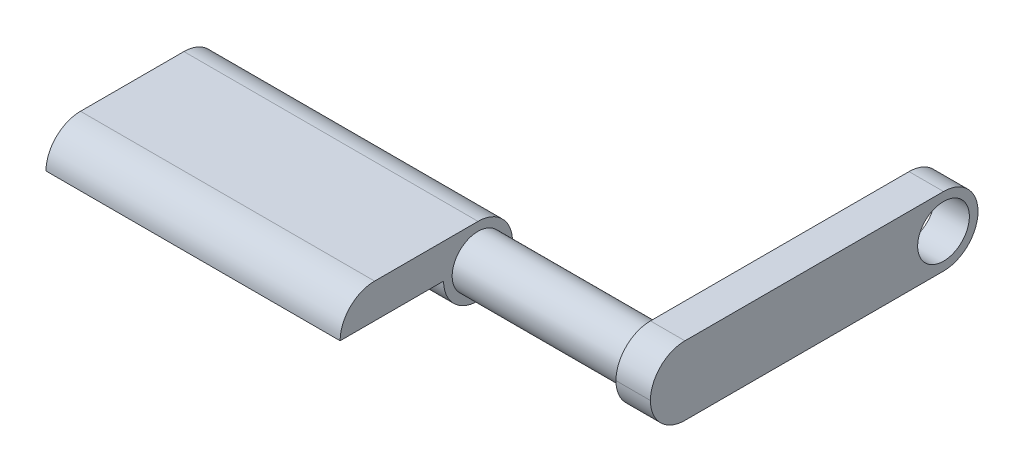
ISO-10303-21;
HEADER;
FILE_DESCRIPTION(('STEP AP214'),'2;1');
FILE_NAME('part.step','',(''),(''),'','','');
FILE_SCHEMA(('AUTOMOTIVE_DESIGN { 1 0 10303 214 1 1 1 1 }'));
ENDSEC;
DATA;
#1=APPLICATION_CONTEXT('core data for automotive mechanical design processes');
#2=APPLICATION_PROTOCOL_DEFINITION('international standard','automotive_design',2000,#1);
#3=PRODUCT_CONTEXT('',#1,'mechanical');
#4=PRODUCT('Part','Part','',(#3));
#5=PRODUCT_RELATED_PRODUCT_CATEGORY('part','',(#4));
#6=PRODUCT_DEFINITION_FORMATION('','',#4);
#7=PRODUCT_DEFINITION_CONTEXT('part definition',#1,'design');
#8=PRODUCT_DEFINITION('design','',#6,#7);
#9=PRODUCT_DEFINITION_SHAPE('','',#8);
#10=(LENGTH_UNIT() NAMED_UNIT(*) SI_UNIT(.MILLI.,.METRE.));
#11=(NAMED_UNIT(*) PLANE_ANGLE_UNIT() SI_UNIT($,.RADIAN.));
#12=(NAMED_UNIT(*) SI_UNIT($,.STERADIAN.) SOLID_ANGLE_UNIT());
#13=UNCERTAINTY_MEASURE_WITH_UNIT(LENGTH_MEASURE(1.E-05),#10,'distance_accuracy_value','');
#14=(GEOMETRIC_REPRESENTATION_CONTEXT(3) GLOBAL_UNCERTAINTY_ASSIGNED_CONTEXT((#13)) GLOBAL_UNIT_ASSIGNED_CONTEXT((#10,
#11,#12)) REPRESENTATION_CONTEXT('',''));
#15=CARTESIAN_POINT('',(0.,0.,0.));
#16=DIRECTION('',(0.,0.,1.));
#17=DIRECTION('',(1.,0.,0.));
#18=AXIS2_PLACEMENT_3D('',#15,#16,#17);
#19=CARTESIAN_POINT('',(29.06,0.,0.));
#20=DIRECTION('',(-1.,0.,0.));
#21=DIRECTION('',(0.,0.,1.));
#22=AXIS2_PLACEMENT_3D('',#19,#20,#21);
#23=CYLINDRICAL_SURFACE('',#22,1.5);
#24=CARTESIAN_POINT('',(17.06,0.,0.));
#25=DIRECTION('',(1.,0.,0.));
#26=DIRECTION('',(0.,0.,-1.));
#27=AXIS2_PLACEMENT_3D('',#24,#25,#26);
#28=CIRCLE('',#27,1.5);
#29=CARTESIAN_POINT('',(17.06,0.,-1.5));
#30=VERTEX_POINT('',#29);
#31=EDGE_CURVE('E148',#30,#30,#28,.T.);
#32=ORIENTED_EDGE('',*,*,#31,.T.);
#33=EDGE_LOOP('',(#32));
#34=FACE_BOUND('',#33,.T.);
#35=CARTESIAN_POINT('',(27.06,0.,0.));
#36=DIRECTION('',(1.,0.,0.));
#37=DIRECTION('',(0.,0.,-1.));
#38=AXIS2_PLACEMENT_3D('',#35,#36,#37);
#39=CIRCLE('',#38,1.5);
#40=CARTESIAN_POINT('',(27.06,0.,-1.5));
#41=VERTEX_POINT('',#40);
#42=EDGE_CURVE('E151',#41,#41,#39,.T.);
#43=ORIENTED_EDGE('',*,*,#42,.F.);
#44=EDGE_LOOP('',(#43));
#45=FACE_BOUND('',#44,.T.);
#46=ADVANCED_FACE('F33',(#34,#45),#23,.T.);
#47=CARTESIAN_POINT('',(17.06,0.,0.));
#48=DIRECTION('',(-1.,0.,0.));
#49=DIRECTION('',(0.,0.,1.));
#50=AXIS2_PLACEMENT_3D('',#47,#48,#49);
#51=CYLINDRICAL_SURFACE('',#50,2.);
#52=CARTESIAN_POINT('',(17.06,0.,0.));
#53=DIRECTION('',(1.,0.,0.));
#54=DIRECTION('',(0.,0.,-1.));
#55=AXIS2_PLACEMENT_3D('',#52,#53,#54);
#56=CIRCLE('',#55,2.);
#57=CARTESIAN_POINT('',(17.06,0.,2.));
#58=VERTEX_POINT('',#57);
#59=CARTESIAN_POINT('',(17.06,2.,0.));
#60=VERTEX_POINT('',#59);
#61=EDGE_CURVE('E152',#58,#60,#56,.T.);
#62=ORIENTED_EDGE('',*,*,#61,.F.);
#63=DIRECTION('',(-1.,0.,0.));
#64=VECTOR('',#63,1.);
#65=CARTESIAN_POINT('',(17.06,0.,2.));
#66=LINE('',#65,#64);
#67=CARTESIAN_POINT('',(0.,0.,2.));
#68=VERTEX_POINT('',#67);
#69=EDGE_CURVE('E121',#58,#68,#66,.T.);
#70=ORIENTED_EDGE('',*,*,#69,.T.);
#71=CARTESIAN_POINT('',(0.,0.,0.));
#72=DIRECTION('',(1.,0.,0.));
#73=DIRECTION('',(0.,0.,-1.));
#74=AXIS2_PLACEMENT_3D('',#71,#72,#73);
#75=CIRCLE('',#74,2.);
#76=CARTESIAN_POINT('',(0.,2.,0.));
#77=VERTEX_POINT('',#76);
#78=EDGE_CURVE('E143',#68,#77,#75,.T.);
#79=ORIENTED_EDGE('',*,*,#78,.T.);
#80=DIRECTION('',(-1.,0.,0.));
#81=VECTOR('',#80,1.);
#82=CARTESIAN_POINT('',(25.3062112512353,2.,0.));
#83=LINE('',#82,#81);
#84=EDGE_CURVE('E125',#60,#77,#83,.T.);
#85=ORIENTED_EDGE('',*,*,#84,.F.);
#86=EDGE_LOOP('',(#62,#70,#79,#85));
#87=FACE_BOUND('',#86,.T.);
#88=ADVANCED_FACE('F237',(#87),#51,.T.);
#89=CARTESIAN_POINT('',(17.06,0.,0.));
#90=DIRECTION('',(1.,0.,0.));
#91=DIRECTION('',(0.,0.,-1.));
#92=AXIS2_PLACEMENT_3D('',#89,#90,#91);
#93=PLANE('',#92);
#94=ORIENTED_EDGE('',*,*,#31,.F.);
#95=EDGE_LOOP('',(#94));
#96=FACE_BOUND('',#95,.T.);
#97=DIRECTION('',(0.,0.,-1.));
#98=VECTOR('',#97,1.);
#99=CARTESIAN_POINT('',(17.06,2.,0.));
#100=LINE('',#99,#98);
#101=CARTESIAN_POINT('',(17.06,2.,6.));
#102=VERTEX_POINT('',#101);
#103=EDGE_CURVE('E113',#102,#60,#100,.T.);
#104=ORIENTED_EDGE('',*,*,#103,.F.);
#105=CARTESIAN_POINT('',(17.06,0.,6.));
#106=DIRECTION('',(1.,0.,0.));
#107=DIRECTION('',(0.,0.,-1.));
#108=AXIS2_PLACEMENT_3D('',#105,#106,#107);
#109=CIRCLE('',#108,2.);
#110=CARTESIAN_POINT('',(17.06,0.,8.));
#111=VERTEX_POINT('',#110);
#112=EDGE_CURVE('E11',#102,#111,#109,.T.);
#113=ORIENTED_EDGE('',*,*,#112,.T.);
#114=DIRECTION('',(0.,0.,1.));
#115=VECTOR('',#114,1.);
#116=CARTESIAN_POINT('',(17.06,0.,0.));
#117=LINE('',#116,#115);
#118=EDGE_CURVE('E111',#58,#111,#117,.T.);
#119=ORIENTED_EDGE('',*,*,#118,.F.);
#120=ORIENTED_EDGE('',*,*,#61,.T.);
#121=EDGE_LOOP('',(#104,#113,#119,#120));
#122=FACE_BOUND('',#121,.T.);
#123=ADVANCED_FACE('F109',(#96,#122),#93,.T.);
#124=CARTESIAN_POINT('',(0.,0.,0.));
#125=DIRECTION('',(1.,0.,0.));
#126=DIRECTION('',(0.,0.,-1.));
#127=AXIS2_PLACEMENT_3D('',#124,#125,#126);
#128=PLANE('',#127);
#129=DIRECTION('',(0.,0.,1.));
#130=VECTOR('',#129,1.);
#131=CARTESIAN_POINT('',(0.,0.,0.));
#132=LINE('',#131,#130);
#133=CARTESIAN_POINT('',(0.,0.,8.));
#134=VERTEX_POINT('',#133);
#135=EDGE_CURVE('E385',#68,#134,#132,.T.);
#136=ORIENTED_EDGE('',*,*,#135,.T.);
#137=CARTESIAN_POINT('',(0.,0.,6.));
#138=DIRECTION('',(1.,0.,0.));
#139=DIRECTION('',(0.,0.,-1.));
#140=AXIS2_PLACEMENT_3D('',#137,#138,#139);
#141=CIRCLE('',#140,2.);
#142=CARTESIAN_POINT('',(0.,2.,6.));
#143=VERTEX_POINT('',#142);
#144=EDGE_CURVE('E55',#134,#143,#141,.F.);
#145=ORIENTED_EDGE('',*,*,#144,.T.);
#146=DIRECTION('',(0.,0.,-1.));
#147=VECTOR('',#146,1.);
#148=CARTESIAN_POINT('',(0.,2.,0.));
#149=LINE('',#148,#147);
#150=EDGE_CURVE('E122',#143,#77,#149,.T.);
#151=ORIENTED_EDGE('',*,*,#150,.T.);
#152=ORIENTED_EDGE('',*,*,#78,.F.);
#153=EDGE_LOOP('',(#136,#145,#151,#152));
#154=FACE_BOUND('',#153,.T.);
#155=ADVANCED_FACE('F249',(#154),#128,.F.);
#156=CARTESIAN_POINT('',(27.06,2.,2.));
#157=DIRECTION('',(0.,1.,0.));
#158=DIRECTION('',(0.,0.,1.));
#159=AXIS2_PLACEMENT_3D('',#156,#157,#158);
#160=PLANE('',#159);
#161=DIRECTION('',(0.,0.,1.));
#162=VECTOR('',#161,1.);
#163=CARTESIAN_POINT('',(29.06,2.,2.));
#164=LINE('',#163,#162);
#165=CARTESIAN_POINT('',(29.06,2.,-15.));
#166=VERTEX_POINT('',#165);
#167=CARTESIAN_POINT('',(29.06,2.,0.));
#168=VERTEX_POINT('',#167);
#169=EDGE_CURVE('E141',#166,#168,#164,.T.);
#170=ORIENTED_EDGE('',*,*,#169,.F.);
#171=DIRECTION('',(-1.,0.,0.));
#172=VECTOR('',#171,1.);
#173=CARTESIAN_POINT('',(27.06,2.,-15.));
#174=LINE('',#173,#172);
#175=CARTESIAN_POINT('',(27.06,2.,-15.));
#176=VERTEX_POINT('',#175);
#177=EDGE_CURVE('E187',#166,#176,#174,.T.);
#178=ORIENTED_EDGE('',*,*,#177,.T.);
#179=DIRECTION('',(0.,0.,1.));
#180=VECTOR('',#179,1.);
#181=CARTESIAN_POINT('',(27.06,2.,2.));
#182=LINE('',#181,#180);
#183=CARTESIAN_POINT('',(27.06,2.,0.));
#184=VERTEX_POINT('',#183);
#185=EDGE_CURVE('E140',#176,#184,#182,.T.);
#186=ORIENTED_EDGE('',*,*,#185,.T.);
#187=DIRECTION('',(1.,0.,0.));
#188=VECTOR('',#187,1.);
#189=CARTESIAN_POINT('',(27.06,2.,0.));
#190=LINE('',#189,#188);
#191=EDGE_CURVE('E158',#184,#168,#190,.T.);
#192=ORIENTED_EDGE('',*,*,#191,.T.);
#193=EDGE_LOOP('',(#170,#178,#186,#192));
#194=FACE_BOUND('',#193,.T.);
#195=ADVANCED_FACE('F206',(#194),#160,.T.);
#196=CARTESIAN_POINT('',(27.06,-2.,2.));
#197=DIRECTION('',(0.,-1.,0.));
#198=DIRECTION('',(0.,0.,-1.));
#199=AXIS2_PLACEMENT_3D('',#196,#197,#198);
#200=PLANE('',#199);
#201=DIRECTION('',(0.,0.,-1.));
#202=VECTOR('',#201,1.);
#203=CARTESIAN_POINT('',(27.06,-2.,2.));
#204=LINE('',#203,#202);
#205=CARTESIAN_POINT('',(27.06,-2.,0.));
#206=VERTEX_POINT('',#205);
#207=CARTESIAN_POINT('',(27.06,-2.,-15.));
#208=VERTEX_POINT('',#207);
#209=EDGE_CURVE('E137',#206,#208,#204,.T.);
#210=ORIENTED_EDGE('',*,*,#209,.T.);
#211=DIRECTION('',(1.,0.,0.));
#212=VECTOR('',#211,1.);
#213=CARTESIAN_POINT('',(27.06,-2.,-15.));
#214=LINE('',#213,#212);
#215=CARTESIAN_POINT('',(29.06,-2.,-15.));
#216=VERTEX_POINT('',#215);
#217=EDGE_CURVE('E176',#208,#216,#214,.T.);
#218=ORIENTED_EDGE('',*,*,#217,.T.);
#219=DIRECTION('',(0.,0.,-1.));
#220=VECTOR('',#219,1.);
#221=CARTESIAN_POINT('',(29.06,-2.,2.));
#222=LINE('',#221,#220);
#223=CARTESIAN_POINT('',(29.06,-2.,0.));
#224=VERTEX_POINT('',#223);
#225=EDGE_CURVE('E144',#224,#216,#222,.T.);
#226=ORIENTED_EDGE('',*,*,#225,.F.);
#227=DIRECTION('',(1.,0.,0.));
#228=VECTOR('',#227,1.);
#229=CARTESIAN_POINT('',(27.06,-2.,0.));
#230=LINE('',#229,#228);
#231=EDGE_CURVE('E172',#224,#206,#230,.F.);
#232=ORIENTED_EDGE('',*,*,#231,.T.);
#233=EDGE_LOOP('',(#210,#218,#226,#232));
#234=FACE_BOUND('',#233,.T.);
#235=ADVANCED_FACE('F217',(#234),#200,.T.);
#236=CARTESIAN_POINT('',(27.06,0.,0.));
#237=DIRECTION('',(1.,0.,0.));
#238=DIRECTION('',(0.,0.,-1.));
#239=AXIS2_PLACEMENT_3D('',#236,#237,#238);
#240=PLANE('',#239);
#241=CARTESIAN_POINT('',(27.06,0.,-15.));
#242=DIRECTION('',(1.,0.,0.));
#243=DIRECTION('',(0.,0.,-1.));
#244=AXIS2_PLACEMENT_3D('',#241,#242,#243);
#245=CIRCLE('',#244,1.5);
#246=CARTESIAN_POINT('',(27.06,0.,-16.5));
#247=VERTEX_POINT('',#246);
#248=EDGE_CURVE('E133',#247,#247,#245,.T.);
#249=ORIENTED_EDGE('',*,*,#248,.T.);
#250=EDGE_LOOP('',(#249));
#251=FACE_BOUND('',#250,.T.);
#252=ORIENTED_EDGE('',*,*,#42,.T.);
#253=EDGE_LOOP('',(#252));
#254=FACE_BOUND('',#253,.T.);
#255=CARTESIAN_POINT('',(27.06,0.,-15.));
#256=DIRECTION('',(1.,0.,0.));
#257=DIRECTION('',(0.,0.,-1.));
#258=AXIS2_PLACEMENT_3D('',#255,#256,#257);
#259=CIRCLE('',#258,2.);
#260=CARTESIAN_POINT('',(27.06,0.,-17.));
#261=VERTEX_POINT('',#260);
#262=EDGE_CURVE('E183',#176,#261,#259,.F.);
#263=ORIENTED_EDGE('',*,*,#262,.T.);
#264=CARTESIAN_POINT('',(27.06,0.,-15.));
#265=DIRECTION('',(1.,0.,0.));
#266=DIRECTION('',(0.,0.,-1.));
#267=AXIS2_PLACEMENT_3D('',#264,#265,#266);
#268=CIRCLE('',#267,2.);
#269=EDGE_CURVE('E185',#261,#208,#268,.F.);
#270=ORIENTED_EDGE('',*,*,#269,.T.);
#271=ORIENTED_EDGE('',*,*,#209,.F.);
#272=CARTESIAN_POINT('',(27.06,0.,0.));
#273=DIRECTION('',(1.,0.,0.));
#274=DIRECTION('',(0.,0.,-1.));
#275=AXIS2_PLACEMENT_3D('',#272,#273,#274);
#276=CIRCLE('',#275,2.);
#277=CARTESIAN_POINT('',(27.06,0.,2.));
#278=VERTEX_POINT('',#277);
#279=EDGE_CURVE('E174',#206,#278,#276,.F.);
#280=ORIENTED_EDGE('',*,*,#279,.T.);
#281=CARTESIAN_POINT('',(27.06,0.,0.));
#282=DIRECTION('',(1.,0.,0.));
#283=DIRECTION('',(0.,0.,-1.));
#284=AXIS2_PLACEMENT_3D('',#281,#282,#283);
#285=CIRCLE('',#284,2.);
#286=EDGE_CURVE('E167',#278,#184,#285,.F.);
#287=ORIENTED_EDGE('',*,*,#286,.T.);
#288=ORIENTED_EDGE('',*,*,#185,.F.);
#289=EDGE_LOOP('',(#263,#270,#271,#280,#287,#288));
#290=FACE_BOUND('',#289,.T.);
#291=ADVANCED_FACE('F222',(#251,#254,#290),#240,.F.);
#292=CARTESIAN_POINT('',(29.06,0.,0.));
#293=DIRECTION('',(1.,0.,0.));
#294=DIRECTION('',(0.,0.,-1.));
#295=AXIS2_PLACEMENT_3D('',#292,#293,#294);
#296=PLANE('',#295);
#297=CARTESIAN_POINT('',(29.06,0.,-15.));
#298=DIRECTION('',(1.,0.,0.));
#299=DIRECTION('',(0.,0.,-1.));
#300=AXIS2_PLACEMENT_3D('',#297,#298,#299);
#301=CIRCLE('',#300,1.5);
#302=CARTESIAN_POINT('',(29.06,0.,-16.5));
#303=VERTEX_POINT('',#302);
#304=EDGE_CURVE('E130',#303,#303,#301,.T.);
#305=ORIENTED_EDGE('',*,*,#304,.F.);
#306=EDGE_LOOP('',(#305));
#307=FACE_BOUND('',#306,.T.);
#308=ORIENTED_EDGE('',*,*,#225,.T.);
#309=CARTESIAN_POINT('',(29.06,0.,-15.));
#310=DIRECTION('',(1.,0.,0.));
#311=DIRECTION('',(0.,0.,-1.));
#312=AXIS2_PLACEMENT_3D('',#309,#310,#311);
#313=CIRCLE('',#312,2.);
#314=CARTESIAN_POINT('',(29.06,0.,-17.));
#315=VERTEX_POINT('',#314);
#316=EDGE_CURVE('E181',#216,#315,#313,.T.);
#317=ORIENTED_EDGE('',*,*,#316,.T.);
#318=CARTESIAN_POINT('',(29.06,0.,-15.));
#319=DIRECTION('',(1.,0.,0.));
#320=DIRECTION('',(0.,0.,-1.));
#321=AXIS2_PLACEMENT_3D('',#318,#319,#320);
#322=CIRCLE('',#321,2.);
#323=EDGE_CURVE('E179',#315,#166,#322,.T.);
#324=ORIENTED_EDGE('',*,*,#323,.T.);
#325=ORIENTED_EDGE('',*,*,#169,.T.);
#326=CARTESIAN_POINT('',(29.06,0.,0.));
#327=DIRECTION('',(1.,0.,0.));
#328=DIRECTION('',(0.,0.,-1.));
#329=AXIS2_PLACEMENT_3D('',#326,#327,#328);
#330=CIRCLE('',#329,2.);
#331=CARTESIAN_POINT('',(29.06,0.,2.));
#332=VERTEX_POINT('',#331);
#333=EDGE_CURVE('E161',#168,#332,#330,.T.);
#334=ORIENTED_EDGE('',*,*,#333,.T.);
#335=CARTESIAN_POINT('',(29.06,0.,0.));
#336=DIRECTION('',(1.,0.,0.));
#337=DIRECTION('',(0.,0.,-1.));
#338=AXIS2_PLACEMENT_3D('',#335,#336,#337);
#339=CIRCLE('',#338,2.);
#340=EDGE_CURVE('E170',#332,#224,#339,.T.);
#341=ORIENTED_EDGE('',*,*,#340,.T.);
#342=EDGE_LOOP('',(#308,#317,#324,#325,#334,#341));
#343=FACE_BOUND('',#342,.T.);
#344=ADVANCED_FACE('F203',(#307,#343),#296,.T.);
#345=CARTESIAN_POINT('',(27.06,0.,0.));
#346=DIRECTION('',(1.,0.,0.));
#347=DIRECTION('',(0.,0.,-1.));
#348=AXIS2_PLACEMENT_3D('',#345,#346,#347);
#349=CYLINDRICAL_SURFACE('',#348,2.);
#350=ORIENTED_EDGE('',*,*,#286,.F.);
#351=DIRECTION('',(1.,0.,0.));
#352=VECTOR('',#351,1.);
#353=CARTESIAN_POINT('',(27.06,0.,2.));
#354=LINE('',#353,#352);
#355=EDGE_CURVE('E164',#332,#278,#354,.F.);
#356=ORIENTED_EDGE('',*,*,#355,.F.);
#357=ORIENTED_EDGE('',*,*,#333,.F.);
#358=ORIENTED_EDGE('',*,*,#191,.F.);
#359=EDGE_LOOP('',(#350,#356,#357,#358));
#360=FACE_BOUND('',#359,.T.);
#361=ADVANCED_FACE('F211',(#360),#349,.T.);
#362=CARTESIAN_POINT('',(27.06,0.,0.));
#363=DIRECTION('',(1.,0.,0.));
#364=DIRECTION('',(0.,0.,-1.));
#365=AXIS2_PLACEMENT_3D('',#362,#363,#364);
#366=CYLINDRICAL_SURFACE('',#365,2.);
#367=ORIENTED_EDGE('',*,*,#279,.F.);
#368=ORIENTED_EDGE('',*,*,#231,.F.);
#369=ORIENTED_EDGE('',*,*,#340,.F.);
#370=ORIENTED_EDGE('',*,*,#355,.T.);
#371=EDGE_LOOP('',(#367,#368,#369,#370));
#372=FACE_BOUND('',#371,.T.);
#373=ADVANCED_FACE('F220',(#372),#366,.T.);
#374=CARTESIAN_POINT('',(27.06,0.,-15.));
#375=DIRECTION('',(-1.,0.,0.));
#376=DIRECTION('',(0.,0.,1.));
#377=AXIS2_PLACEMENT_3D('',#374,#375,#376);
#378=CYLINDRICAL_SURFACE('',#377,2.);
#379=DIRECTION('',(-1.,0.,0.));
#380=VECTOR('',#379,1.);
#381=CARTESIAN_POINT('',(0.,0.,-17.));
#382=LINE('',#381,#380);
#383=EDGE_CURVE('E136',#261,#315,#382,.F.);
#384=ORIENTED_EDGE('',*,*,#383,.F.);
#385=ORIENTED_EDGE('',*,*,#262,.F.);
#386=ORIENTED_EDGE('',*,*,#177,.F.);
#387=ORIENTED_EDGE('',*,*,#323,.F.);
#388=EDGE_LOOP('',(#384,#385,#386,#387));
#389=FACE_BOUND('',#388,.T.);
#390=ADVANCED_FACE('F199',(#389),#378,.T.);
#391=CARTESIAN_POINT('',(27.06,0.,-15.));
#392=DIRECTION('',(1.,0.,0.));
#393=DIRECTION('',(0.,0.,-1.));
#394=AXIS2_PLACEMENT_3D('',#391,#392,#393);
#395=CYLINDRICAL_SURFACE('',#394,2.);
#396=ORIENTED_EDGE('',*,*,#269,.F.);
#397=ORIENTED_EDGE('',*,*,#383,.T.);
#398=ORIENTED_EDGE('',*,*,#316,.F.);
#399=ORIENTED_EDGE('',*,*,#217,.F.);
#400=EDGE_LOOP('',(#396,#397,#398,#399));
#401=FACE_BOUND('',#400,.T.);
#402=ADVANCED_FACE('F194',(#401),#395,.T.);
#403=CARTESIAN_POINT('',(0.,0.,-15.));
#404=DIRECTION('',(1.,0.,0.));
#405=DIRECTION('',(0.,0.,-1.));
#406=AXIS2_PLACEMENT_3D('',#403,#404,#405);
#407=CYLINDRICAL_SURFACE('',#406,1.5);
#408=ORIENTED_EDGE('',*,*,#304,.T.);
#409=EDGE_LOOP('',(#408));
#410=FACE_BOUND('',#409,.T.);
#411=ORIENTED_EDGE('',*,*,#248,.F.);
#412=EDGE_LOOP('',(#411));
#413=FACE_BOUND('',#412,.T.);
#414=ADVANCED_FACE('F258',(#410,#413),#407,.F.);
#415=CARTESIAN_POINT('',(25.3062112512353,0.,0.));
#416=DIRECTION('',(0.,-1.,0.));
#417=DIRECTION('',(0.,0.,-1.));
#418=AXIS2_PLACEMENT_3D('',#415,#416,#417);
#419=PLANE('',#418);
#420=ORIENTED_EDGE('',*,*,#69,.F.);
#421=ORIENTED_EDGE('',*,*,#118,.T.);
#422=DIRECTION('',(-1.,0.,0.));
#423=VECTOR('',#422,1.);
#424=CARTESIAN_POINT('',(25.3062112512353,0.,8.));
#425=LINE('',#424,#423);
#426=EDGE_CURVE('E119',#111,#134,#425,.T.);
#427=ORIENTED_EDGE('',*,*,#426,.T.);
#428=ORIENTED_EDGE('',*,*,#135,.F.);
#429=EDGE_LOOP('',(#420,#421,#427,#428));
#430=FACE_BOUND('',#429,.T.);
#431=ADVANCED_FACE('F118',(#430),#419,.T.);
#432=CARTESIAN_POINT('',(25.3062112512353,2.,0.));
#433=DIRECTION('',(0.,1.,0.));
#434=DIRECTION('',(0.,0.,1.));
#435=AXIS2_PLACEMENT_3D('',#432,#433,#434);
#436=PLANE('',#435);
#437=ORIENTED_EDGE('',*,*,#150,.F.);
#438=DIRECTION('',(-1.,0.,0.));
#439=VECTOR('',#438,1.);
#440=CARTESIAN_POINT('',(25.3062112512353,2.,6.));
#441=LINE('',#440,#439);
#442=EDGE_CURVE('E41',#143,#102,#441,.F.);
#443=ORIENTED_EDGE('',*,*,#442,.T.);
#444=ORIENTED_EDGE('',*,*,#103,.T.);
#445=ORIENTED_EDGE('',*,*,#84,.T.);
#446=EDGE_LOOP('',(#437,#443,#444,#445));
#447=FACE_BOUND('',#446,.T.);
#448=ADVANCED_FACE('F282',(#447),#436,.T.);
#449=CARTESIAN_POINT('',(25.3062112512353,0.,6.));
#450=DIRECTION('',(-1.,0.,0.));
#451=DIRECTION('',(0.,0.,1.));
#452=AXIS2_PLACEMENT_3D('',#449,#450,#451);
#453=CYLINDRICAL_SURFACE('',#452,2.);
#454=ORIENTED_EDGE('',*,*,#112,.F.);
#455=ORIENTED_EDGE('',*,*,#442,.F.);
#456=ORIENTED_EDGE('',*,*,#144,.F.);
#457=ORIENTED_EDGE('',*,*,#426,.F.);
#458=EDGE_LOOP('',(#454,#455,#456,#457));
#459=FACE_BOUND('',#458,.T.);
#460=ADVANCED_FACE('F35',(#459),#453,.T.);
#461=CLOSED_SHELL('',(#46,#88,#123,#155,#195,#235,#291,#344,#361,#373,#390,#402,#414,#431,#448,#460));
#462=MANIFOLD_SOLID_BREP('B2',#461);
#463=ADVANCED_BREP_SHAPE_REPRESENTATION('',(#18,#462),#14);
#464=SHAPE_DEFINITION_REPRESENTATION(#9,#463);
ENDSEC;
END-ISO-10303-21;
